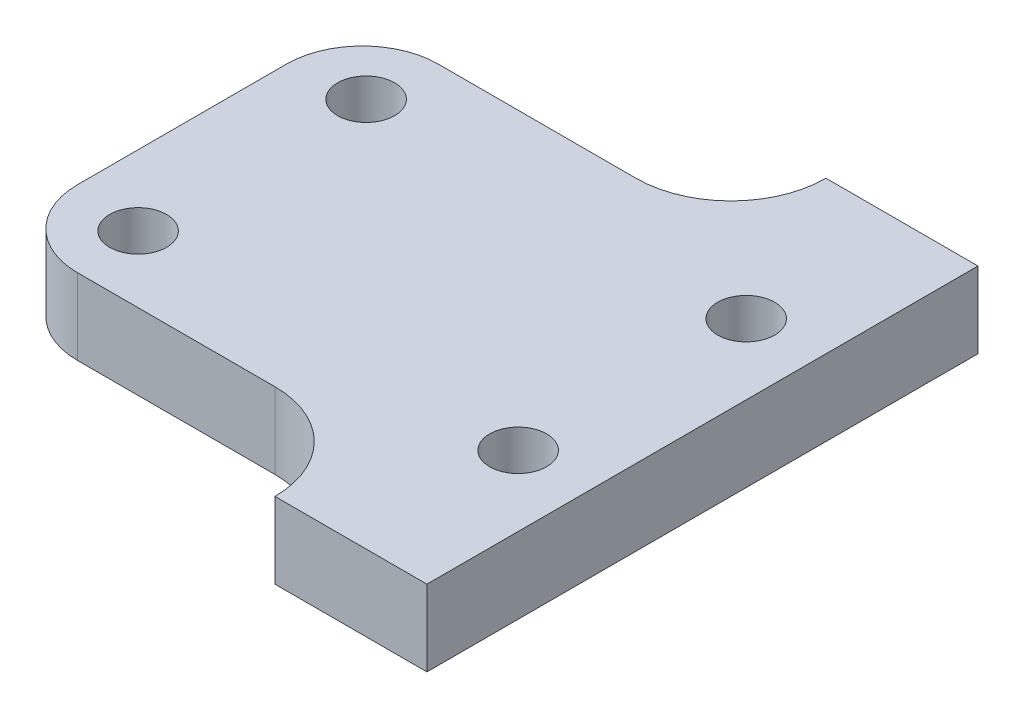
ISO-10303-21;
HEADER;
FILE_DESCRIPTION(('STEP AP214'),'2;1');
FILE_NAME('part.step','',(''),(''),'','','');
FILE_SCHEMA(('AUTOMOTIVE_DESIGN { 1 0 10303 214 1 1 1 1 }'));
ENDSEC;
DATA;
#1=APPLICATION_CONTEXT('core data for automotive mechanical design processes');
#2=APPLICATION_PROTOCOL_DEFINITION('international standard','automotive_design',2000,#1);
#3=PRODUCT_CONTEXT('',#1,'mechanical');
#4=PRODUCT('Part','Part','',(#3));
#5=PRODUCT_RELATED_PRODUCT_CATEGORY('part','',(#4));
#6=PRODUCT_DEFINITION_FORMATION('','',#4);
#7=PRODUCT_DEFINITION_CONTEXT('part definition',#1,'design');
#8=PRODUCT_DEFINITION('design','',#6,#7);
#9=PRODUCT_DEFINITION_SHAPE('','',#8);
#10=(LENGTH_UNIT() NAMED_UNIT(*) SI_UNIT(.MILLI.,.METRE.));
#11=(NAMED_UNIT(*) PLANE_ANGLE_UNIT() SI_UNIT($,.RADIAN.));
#12=(NAMED_UNIT(*) SI_UNIT($,.STERADIAN.) SOLID_ANGLE_UNIT());
#13=UNCERTAINTY_MEASURE_WITH_UNIT(LENGTH_MEASURE(1.E-05),#10,'distance_accuracy_value','');
#14=(GEOMETRIC_REPRESENTATION_CONTEXT(3) GLOBAL_UNCERTAINTY_ASSIGNED_CONTEXT((#13)) GLOBAL_UNIT_ASSIGNED_CONTEXT((#10,
#11,#12)) REPRESENTATION_CONTEXT('',''));
#15=CARTESIAN_POINT('',(0.,0.,0.));
#16=DIRECTION('',(0.,0.,1.));
#17=DIRECTION('',(1.,0.,0.));
#18=AXIS2_PLACEMENT_3D('',#15,#16,#17);
#19=CARTESIAN_POINT('',(-1.64036695723543,0.,3.));
#20=DIRECTION('',(1.,0.,0.));
#21=DIRECTION('',(0.,1.,0.));
#22=AXIS2_PLACEMENT_3D('',#19,#20,#21);
#23=PLANE('',#22);
#24=DIRECTION('',(0.,-1.,0.));
#25=VECTOR('',#24,1.);
#26=CARTESIAN_POINT('',(-1.6403669572354,-2.8815779893049,7.));
#27=LINE('',#26,#25);
#28=CARTESIAN_POINT('',(-1.6403669572354,-6.88157798930491,7.));
#29=VERTEX_POINT('',#28);
#30=CARTESIAN_POINT('',(-1.6403669572354,-2.8815779893049,7.));
#31=VERTEX_POINT('',#30);
#32=EDGE_CURVE('E191',#29,#31,#27,.F.);
#33=ORIENTED_EDGE('',*,*,#32,.T.);
#34=DIRECTION('',(0.,0.,1.));
#35=VECTOR('',#34,1.);
#36=CARTESIAN_POINT('',(-1.6403669572354,-2.8815779893049,-8.));
#37=LINE('',#36,#35);
#38=CARTESIAN_POINT('',(-1.6403669572354,-2.8815779893049,-4.));
#39=VERTEX_POINT('',#38);
#40=EDGE_CURVE('E180',#39,#31,#37,.T.);
#41=ORIENTED_EDGE('',*,*,#40,.F.);
#42=DIRECTION('',(0.,-1.,0.));
#43=VECTOR('',#42,1.);
#44=CARTESIAN_POINT('',(-1.64036695723543,0.,-4.));
#45=LINE('',#44,#43);
#46=CARTESIAN_POINT('',(-1.6403669572354,-6.88157798930491,-4.));
#47=VERTEX_POINT('',#46);
#48=EDGE_CURVE('E194',#39,#47,#45,.T.);
#49=ORIENTED_EDGE('',*,*,#48,.T.);
#50=DIRECTION('',(0.,0.,-1.));
#51=VECTOR('',#50,1.);
#52=CARTESIAN_POINT('',(-1.6403669572354,-6.88157798930491,3.));
#53=LINE('',#52,#51);
#54=EDGE_CURVE('E123',#29,#47,#53,.T.);
#55=ORIENTED_EDGE('',*,*,#54,.F.);
#56=EDGE_LOOP('',(#33,#41,#49,#55));
#57=FACE_BOUND('',#56,.T.);
#58=ADVANCED_FACE('F36',(#57),#23,.F.);
#59=CARTESIAN_POINT('',(25.7596330403458,-4.46858401878444E-13,3.));
#60=DIRECTION('',(-1.,0.,0.));
#61=DIRECTION('',(0.,-1.,0.));
#62=AXIS2_PLACEMENT_3D('',#59,#60,#61);
#63=PLANE('',#62);
#64=DIRECTION('',(0.,-1.,0.));
#65=VECTOR('',#64,1.);
#66=CARTESIAN_POINT('',(25.7596330403457,-2.8815779893049,-13.));
#67=LINE('',#66,#65);
#68=CARTESIAN_POINT('',(25.7596330403457,-2.8815779893049,-13.));
#69=VERTEX_POINT('',#68);
#70=CARTESIAN_POINT('',(25.7596330403457,-6.88157798930491,-13.));
#71=VERTEX_POINT('',#70);
#72=EDGE_CURVE('E117',#69,#71,#67,.T.);
#73=ORIENTED_EDGE('',*,*,#72,.F.);
#74=DIRECTION('',(0.,0.,-1.));
#75=VECTOR('',#74,1.);
#76=CARTESIAN_POINT('',(25.7596330403457,-2.8815779893049,11.));
#77=LINE('',#76,#75);
#78=CARTESIAN_POINT('',(25.7596330403457,-2.88157798930491,16.));
#79=VERTEX_POINT('',#78);
#80=EDGE_CURVE('E124',#79,#69,#77,.T.);
#81=ORIENTED_EDGE('',*,*,#80,.F.);
#82=DIRECTION('',(0.,1.,0.));
#83=VECTOR('',#82,1.);
#84=CARTESIAN_POINT('',(25.7596330403457,-6.88157798930491,16.));
#85=LINE('',#84,#83);
#86=CARTESIAN_POINT('',(25.7596330403457,-6.88157798930491,16.));
#87=VERTEX_POINT('',#86);
#88=EDGE_CURVE('E119',#87,#79,#85,.T.);
#89=ORIENTED_EDGE('',*,*,#88,.F.);
#90=DIRECTION('',(0.,0.,-1.));
#91=VECTOR('',#90,1.);
#92=CARTESIAN_POINT('',(25.7596330403457,-6.88157798930491,3.));
#93=LINE('',#92,#91);
#94=EDGE_CURVE('E113',#87,#71,#93,.T.);
#95=ORIENTED_EDGE('',*,*,#94,.T.);
#96=EDGE_LOOP('',(#73,#81,#89,#95));
#97=FACE_BOUND('',#96,.T.);
#98=ADVANCED_FACE('F115',(#97),#63,.F.);
#99=CARTESIAN_POINT('',(0.,0.,-8.));
#100=DIRECTION('',(0.,0.,1.));
#101=DIRECTION('',(1.,0.,0.));
#102=AXIS2_PLACEMENT_3D('',#99,#100,#101);
#103=PLANE('',#102);
#104=DIRECTION('',(1.,0.,0.));
#105=VECTOR('',#104,1.);
#106=CARTESIAN_POINT('',(0.,-2.8815779893049,-8.));
#107=LINE('',#106,#105);
#108=CARTESIAN_POINT('',(2.3596330427646,-2.8815779893049,-8.));
#109=VERTEX_POINT('',#108);
#110=CARTESIAN_POINT('',(12.7596330403457,-2.8815779893049,-8.));
#111=VERTEX_POINT('',#110);
#112=EDGE_CURVE('E178',#109,#111,#107,.T.);
#113=ORIENTED_EDGE('',*,*,#112,.T.);
#114=DIRECTION('',(0.,1.,0.));
#115=VECTOR('',#114,1.);
#116=CARTESIAN_POINT('',(12.7596330403457,-6.88157798930491,-8.));
#117=LINE('',#116,#115);
#118=CARTESIAN_POINT('',(12.7596330403457,-6.88157798930491,-8.));
#119=VERTEX_POINT('',#118);
#120=EDGE_CURVE('E57',#111,#119,#117,.F.);
#121=ORIENTED_EDGE('',*,*,#120,.T.);
#122=DIRECTION('',(1.,0.,0.));
#123=VECTOR('',#122,1.);
#124=CARTESIAN_POINT('',(0.,-6.88157798930491,-8.));
#125=LINE('',#124,#123);
#126=CARTESIAN_POINT('',(2.35963304276464,-6.88157798930491,-8.));
#127=VERTEX_POINT('',#126);
#128=EDGE_CURVE('E176',#127,#119,#125,.T.);
#129=ORIENTED_EDGE('',*,*,#128,.F.);
#130=DIRECTION('',(0.,-1.,0.));
#131=VECTOR('',#130,1.);
#132=CARTESIAN_POINT('',(2.35963304276457,0.,-8.));
#133=LINE('',#132,#131);
#134=EDGE_CURVE('E201',#127,#109,#133,.F.);
#135=ORIENTED_EDGE('',*,*,#134,.T.);
#136=EDGE_LOOP('',(#113,#121,#129,#135));
#137=FACE_BOUND('',#136,.T.);
#138=ADVANCED_FACE('F243',(#137),#103,.F.);
#139=CARTESIAN_POINT('',(0.,0.,11.));
#140=DIRECTION('',(0.,0.,1.));
#141=DIRECTION('',(1.,0.,0.));
#142=AXIS2_PLACEMENT_3D('',#139,#140,#141);
#143=PLANE('',#142);
#144=DIRECTION('',(1.,0.,0.));
#145=VECTOR('',#144,1.);
#146=CARTESIAN_POINT('',(0.,-6.88157798930491,11.));
#147=LINE('',#146,#145);
#148=CARTESIAN_POINT('',(2.35963304276464,-6.88157798930491,11.));
#149=VERTEX_POINT('',#148);
#150=CARTESIAN_POINT('',(12.7596330403457,-6.88157798930491,11.));
#151=VERTEX_POINT('',#150);
#152=EDGE_CURVE('E182',#149,#151,#147,.T.);
#153=ORIENTED_EDGE('',*,*,#152,.T.);
#154=DIRECTION('',(0.,-1.,0.));
#155=VECTOR('',#154,1.);
#156=CARTESIAN_POINT('',(12.7596330403457,0.,11.));
#157=LINE('',#156,#155);
#158=CARTESIAN_POINT('',(12.7596330403457,-2.8815779893049,11.));
#159=VERTEX_POINT('',#158);
#160=EDGE_CURVE('E210',#151,#159,#157,.F.);
#161=ORIENTED_EDGE('',*,*,#160,.T.);
#162=DIRECTION('',(1.,0.,0.));
#163=VECTOR('',#162,1.);
#164=CARTESIAN_POINT('',(0.,-2.8815779893049,11.));
#165=LINE('',#164,#163);
#166=CARTESIAN_POINT('',(2.3596330427646,-2.8815779893049,11.));
#167=VERTEX_POINT('',#166);
#168=EDGE_CURVE('E185',#167,#159,#165,.T.);
#169=ORIENTED_EDGE('',*,*,#168,.F.);
#170=DIRECTION('',(0.,-1.,0.));
#171=VECTOR('',#170,1.);
#172=CARTESIAN_POINT('',(2.35963304276464,-6.88157798930487,11.));
#173=LINE('',#172,#171);
#174=EDGE_CURVE('E205',#167,#149,#173,.T.);
#175=ORIENTED_EDGE('',*,*,#174,.T.);
#176=EDGE_LOOP('',(#153,#161,#169,#175));
#177=FACE_BOUND('',#176,.T.);
#178=ADVANCED_FACE('F229',(#177),#143,.T.);
#179=CARTESIAN_POINT('',(0.,-6.88157798930491,3.));
#180=DIRECTION('',(0.,1.,0.));
#181=DIRECTION('',(0.,0.,1.));
#182=AXIS2_PLACEMENT_3D('',#179,#180,#181);
#183=PLANE('',#182);
#184=CARTESIAN_POINT('',(22.0596330415552,-6.88157798930491,7.5));
#185=DIRECTION('',(0.,1.,0.));
#186=DIRECTION('',(0.,0.,1.));
#187=AXIS2_PLACEMENT_3D('',#184,#185,#186);
#188=CIRCLE('',#187,1.5);
#189=CARTESIAN_POINT('',(22.0596330415552,-6.88157798930491,9.));
#190=VERTEX_POINT('',#189);
#191=EDGE_CURVE('E170',#190,#190,#188,.T.);
#192=ORIENTED_EDGE('',*,*,#191,.T.);
#193=EDGE_LOOP('',(#192));
#194=FACE_BOUND('',#193,.T.);
#195=CARTESIAN_POINT('',(22.0596330415552,-6.88157798930491,-4.5));
#196=DIRECTION('',(0.,1.,0.));
#197=DIRECTION('',(0.,0.,1.));
#198=AXIS2_PLACEMENT_3D('',#195,#196,#197);
#199=CIRCLE('',#198,1.5);
#200=CARTESIAN_POINT('',(22.0596330415552,-6.88157798930491,-3.));
#201=VERTEX_POINT('',#200);
#202=EDGE_CURVE('E167',#201,#201,#199,.T.);
#203=ORIENTED_EDGE('',*,*,#202,.T.);
#204=EDGE_LOOP('',(#203));
#205=FACE_BOUND('',#204,.T.);
#206=ORIENTED_EDGE('',*,*,#94,.F.);
#207=DIRECTION('',(1.,0.,0.));
#208=VECTOR('',#207,1.);
#209=CARTESIAN_POINT('',(25.7596330403457,-6.88157798930491,16.));
#210=LINE('',#209,#208);
#211=CARTESIAN_POINT('',(17.7596330403457,-6.88157798930491,16.));
#212=VERTEX_POINT('',#211);
#213=EDGE_CURVE('E150',#212,#87,#210,.T.);
#214=ORIENTED_EDGE('',*,*,#213,.F.);
#215=CARTESIAN_POINT('',(12.7596330403457,-6.88157798930491,16.));
#216=DIRECTION('',(0.,1.,0.));
#217=DIRECTION('',(0.,0.,1.));
#218=AXIS2_PLACEMENT_3D('',#215,#216,#217);
#219=CIRCLE('',#218,5.);
#220=EDGE_CURVE('E213',#212,#151,#219,.T.);
#221=ORIENTED_EDGE('',*,*,#220,.T.);
#222=ORIENTED_EDGE('',*,*,#152,.F.);
#223=CARTESIAN_POINT('',(2.35963304276464,-6.88157798930491,7.));
#224=DIRECTION('',(0.,1.,0.));
#225=DIRECTION('',(0.,0.,1.));
#226=AXIS2_PLACEMENT_3D('',#223,#224,#225);
#227=CIRCLE('',#226,4.);
#228=EDGE_CURVE('E197',#149,#29,#227,.F.);
#229=ORIENTED_EDGE('',*,*,#228,.T.);
#230=ORIENTED_EDGE('',*,*,#54,.T.);
#231=CARTESIAN_POINT('',(2.35963304276464,-6.88157798930491,-4.));
#232=DIRECTION('',(0.,1.,0.));
#233=DIRECTION('',(0.,0.,1.));
#234=AXIS2_PLACEMENT_3D('',#231,#232,#233);
#235=CIRCLE('',#234,4.);
#236=EDGE_CURVE('E199',#47,#127,#235,.F.);
#237=ORIENTED_EDGE('',*,*,#236,.T.);
#238=ORIENTED_EDGE('',*,*,#128,.T.);
#239=CARTESIAN_POINT('',(12.7596330403457,-6.88157798930491,-13.));
#240=DIRECTION('',(0.,1.,0.));
#241=DIRECTION('',(0.,0.,1.));
#242=AXIS2_PLACEMENT_3D('',#239,#240,#241);
#243=CIRCLE('',#242,5.);
#244=CARTESIAN_POINT('',(17.7596330403457,-6.88157798930491,-13.));
#245=VERTEX_POINT('',#244);
#246=EDGE_CURVE('E11',#119,#245,#243,.T.);
#247=ORIENTED_EDGE('',*,*,#246,.T.);
#248=DIRECTION('',(-1.,0.,0.));
#249=VECTOR('',#248,1.);
#250=CARTESIAN_POINT('',(25.7596330403457,-6.88157798930491,-13.));
#251=LINE('',#250,#249);
#252=EDGE_CURVE('E127',#71,#245,#251,.T.);
#253=ORIENTED_EDGE('',*,*,#252,.F.);
#254=EDGE_LOOP('',(#206,#214,#221,#222,#229,#230,#237,#238,#247,#253));
#255=FACE_BOUND('',#254,.T.);
#256=CARTESIAN_POINT('',(2.05963304155515,-6.88157798930491,7.5));
#257=DIRECTION('',(0.,1.,0.));
#258=DIRECTION('',(0.,0.,1.));
#259=AXIS2_PLACEMENT_3D('',#256,#257,#258);
#260=CIRCLE('',#259,1.5);
#261=CARTESIAN_POINT('',(2.05963304155515,-6.88157798930491,9.));
#262=VERTEX_POINT('',#261);
#263=EDGE_CURVE('E173',#262,#262,#260,.T.);
#264=ORIENTED_EDGE('',*,*,#263,.T.);
#265=EDGE_LOOP('',(#264));
#266=FACE_BOUND('',#265,.T.);
#267=CARTESIAN_POINT('',(2.05963304155515,-6.88157798930491,-4.5));
#268=DIRECTION('',(0.,1.,0.));
#269=DIRECTION('',(0.,0.,1.));
#270=AXIS2_PLACEMENT_3D('',#267,#268,#269);
#271=CIRCLE('',#270,1.5);
#272=CARTESIAN_POINT('',(2.05963304155515,-6.88157798930491,-3.));
#273=VERTEX_POINT('',#272);
#274=EDGE_CURVE('E164',#273,#273,#271,.T.);
#275=ORIENTED_EDGE('',*,*,#274,.T.);
#276=EDGE_LOOP('',(#275));
#277=FACE_BOUND('',#276,.T.);
#278=ADVANCED_FACE('F128',(#194,#205,#255,#266,#277),#183,.F.);
#279=CARTESIAN_POINT('',(0.,-2.8815779893049,11.));
#280=DIRECTION('',(0.,1.,0.));
#281=DIRECTION('',(0.,0.,1.));
#282=AXIS2_PLACEMENT_3D('',#279,#280,#281);
#283=PLANE('',#282);
#284=CARTESIAN_POINT('',(2.05963304155515,-2.8815779893049,7.5));
#285=DIRECTION('',(0.,1.,0.));
#286=DIRECTION('',(0.,0.,1.));
#287=AXIS2_PLACEMENT_3D('',#284,#285,#286);
#288=CIRCLE('',#287,1.5);
#289=CARTESIAN_POINT('',(2.05963304155515,-2.8815779893049,9.));
#290=VERTEX_POINT('',#289);
#291=EDGE_CURVE('E152',#290,#290,#288,.T.);
#292=ORIENTED_EDGE('',*,*,#291,.F.);
#293=EDGE_LOOP('',(#292));
#294=FACE_BOUND('',#293,.T.);
#295=CARTESIAN_POINT('',(22.0596330415552,-2.8815779893049,7.5));
#296=DIRECTION('',(0.,1.,0.));
#297=DIRECTION('',(0.,0.,1.));
#298=AXIS2_PLACEMENT_3D('',#295,#296,#297);
#299=CIRCLE('',#298,1.5);
#300=CARTESIAN_POINT('',(22.0596330415552,-2.8815779893049,9.));
#301=VERTEX_POINT('',#300);
#302=EDGE_CURVE('E157',#301,#301,#299,.T.);
#303=ORIENTED_EDGE('',*,*,#302,.F.);
#304=EDGE_LOOP('',(#303));
#305=FACE_BOUND('',#304,.T.);
#306=ORIENTED_EDGE('',*,*,#40,.T.);
#307=CARTESIAN_POINT('',(2.3596330427646,-2.8815779893049,7.));
#308=DIRECTION('',(0.,1.,0.));
#309=DIRECTION('',(0.,0.,1.));
#310=AXIS2_PLACEMENT_3D('',#307,#308,#309);
#311=CIRCLE('',#310,4.);
#312=EDGE_CURVE('E208',#31,#167,#311,.T.);
#313=ORIENTED_EDGE('',*,*,#312,.T.);
#314=ORIENTED_EDGE('',*,*,#168,.T.);
#315=CARTESIAN_POINT('',(12.7596330403457,-2.88157798930491,16.));
#316=DIRECTION('',(0.,1.,0.));
#317=DIRECTION('',(0.,0.,1.));
#318=AXIS2_PLACEMENT_3D('',#315,#316,#317);
#319=CIRCLE('',#318,5.);
#320=CARTESIAN_POINT('',(17.7596330403457,-2.88157798930491,16.));
#321=VERTEX_POINT('',#320);
#322=EDGE_CURVE('E215',#159,#321,#319,.F.);
#323=ORIENTED_EDGE('',*,*,#322,.T.);
#324=DIRECTION('',(-1.,0.,0.));
#325=VECTOR('',#324,1.);
#326=CARTESIAN_POINT('',(25.7596330403457,-2.88157798930491,16.));
#327=LINE('',#326,#325);
#328=EDGE_CURVE('E144',#79,#321,#327,.T.);
#329=ORIENTED_EDGE('',*,*,#328,.F.);
#330=ORIENTED_EDGE('',*,*,#80,.T.);
#331=DIRECTION('',(1.,0.,0.));
#332=VECTOR('',#331,1.);
#333=CARTESIAN_POINT('',(25.7596330403457,-2.8815779893049,-13.));
#334=LINE('',#333,#332);
#335=CARTESIAN_POINT('',(17.7596330403457,-2.8815779893049,-13.));
#336=VERTEX_POINT('',#335);
#337=EDGE_CURVE('E138',#336,#69,#334,.T.);
#338=ORIENTED_EDGE('',*,*,#337,.F.);
#339=CARTESIAN_POINT('',(12.7596330403457,-2.8815779893049,-13.));
#340=DIRECTION('',(0.,1.,0.));
#341=DIRECTION('',(0.,0.,1.));
#342=AXIS2_PLACEMENT_3D('',#339,#340,#341);
#343=CIRCLE('',#342,5.);
#344=EDGE_CURVE('E44',#336,#111,#343,.F.);
#345=ORIENTED_EDGE('',*,*,#344,.T.);
#346=ORIENTED_EDGE('',*,*,#112,.F.);
#347=CARTESIAN_POINT('',(2.3596330427646,-2.8815779893049,-4.));
#348=DIRECTION('',(0.,-1.,0.));
#349=DIRECTION('',(0.,0.,-1.));
#350=AXIS2_PLACEMENT_3D('',#347,#348,#349);
#351=CIRCLE('',#350,4.);
#352=EDGE_CURVE('E203',#109,#39,#351,.F.);
#353=ORIENTED_EDGE('',*,*,#352,.T.);
#354=EDGE_LOOP('',(#306,#313,#314,#323,#329,#330,#338,#345,#346,#353));
#355=FACE_BOUND('',#354,.T.);
#356=CARTESIAN_POINT('',(22.0596330415552,-2.8815779893049,-4.5));
#357=DIRECTION('',(0.,1.,0.));
#358=DIRECTION('',(0.,0.,1.));
#359=AXIS2_PLACEMENT_3D('',#356,#357,#358);
#360=CIRCLE('',#359,1.5);
#361=CARTESIAN_POINT('',(22.0596330415552,-2.8815779893049,-3.));
#362=VERTEX_POINT('',#361);
#363=EDGE_CURVE('E153',#362,#362,#360,.T.);
#364=ORIENTED_EDGE('',*,*,#363,.F.);
#365=EDGE_LOOP('',(#364));
#366=FACE_BOUND('',#365,.T.);
#367=CARTESIAN_POINT('',(2.05963304155515,-2.8815779893049,-4.5));
#368=DIRECTION('',(0.,1.,0.));
#369=DIRECTION('',(0.,0.,1.));
#370=AXIS2_PLACEMENT_3D('',#367,#368,#369);
#371=CIRCLE('',#370,1.5);
#372=CARTESIAN_POINT('',(2.05963304155515,-2.8815779893049,-3.));
#373=VERTEX_POINT('',#372);
#374=EDGE_CURVE('E156',#373,#373,#371,.T.);
#375=ORIENTED_EDGE('',*,*,#374,.F.);
#376=EDGE_LOOP('',(#375));
#377=FACE_BOUND('',#376,.T.);
#378=ADVANCED_FACE('F218',(#294,#305,#355,#366,#377),#283,.T.);
#379=CARTESIAN_POINT('',(2.05963304155515,-9.3815779893049,-4.5));
#380=DIRECTION('',(0.,1.,0.));
#381=DIRECTION('',(0.,0.,1.));
#382=AXIS2_PLACEMENT_3D('',#379,#380,#381);
#383=CYLINDRICAL_SURFACE('',#382,1.5);
#384=CARTESIAN_POINT('',(2.05963304155515,-2.8815779893049,-3.));
#385=CARTESIAN_POINT('',(2.05963304155515,-2.92324465597157,-3.));
#386=CARTESIAN_POINT('',(2.05963304155515,-2.96491132263824,-3.));
#387=CARTESIAN_POINT('',(2.05963304155515,-3.04824465597157,-3.));
#388=CARTESIAN_POINT('',(2.05963304155515,-3.08991132263824,-3.));
#389=CARTESIAN_POINT('',(2.05963304155515,-3.17324465597157,-3.));
#390=CARTESIAN_POINT('',(2.05963304155515,-3.21491132263824,-3.));
#391=CARTESIAN_POINT('',(2.05963304155515,-3.29824465597157,-3.));
#392=CARTESIAN_POINT('',(2.05963304155515,-3.33991132263824,-3.));
#393=CARTESIAN_POINT('',(2.05963304155515,-3.42324465597157,-3.));
#394=CARTESIAN_POINT('',(2.05963304155515,-3.46491132263824,-3.));
#395=CARTESIAN_POINT('',(2.05963304155515,-3.54824465597157,-3.));
#396=CARTESIAN_POINT('',(2.05963304155515,-3.58991132263824,-3.));
#397=CARTESIAN_POINT('',(2.05963304155515,-3.67324465597157,-3.));
#398=CARTESIAN_POINT('',(2.05963304155515,-3.71491132263824,-3.));
#399=CARTESIAN_POINT('',(2.05963304155515,-3.79824465597157,-3.));
#400=CARTESIAN_POINT('',(2.05963304155515,-3.83991132263824,-3.));
#401=CARTESIAN_POINT('',(2.05963304155515,-3.92324465597157,-3.));
#402=CARTESIAN_POINT('',(2.05963304155515,-3.96491132263824,-3.));
#403=CARTESIAN_POINT('',(2.05963304155515,-4.04824465597157,-3.));
#404=CARTESIAN_POINT('',(2.05963304155515,-4.08991132263824,-3.));
#405=CARTESIAN_POINT('',(2.05963304155515,-4.17324465597157,-3.));
#406=CARTESIAN_POINT('',(2.05963304155515,-4.21491132263824,-3.));
#407=CARTESIAN_POINT('',(2.05963304155515,-4.29824465597157,-3.));
#408=CARTESIAN_POINT('',(2.05963304155515,-4.33991132263824,-3.));
#409=CARTESIAN_POINT('',(2.05963304155515,-4.42324465597157,-3.));
#410=CARTESIAN_POINT('',(2.05963304155515,-4.46491132263824,-3.));
#411=CARTESIAN_POINT('',(2.05963304155515,-4.54824465597157,-3.));
#412=CARTESIAN_POINT('',(2.05963304155515,-4.58991132263824,-3.));
#413=CARTESIAN_POINT('',(2.05963304155515,-4.67324465597157,-3.));
#414=CARTESIAN_POINT('',(2.05963304155515,-4.71491132263824,-3.));
#415=CARTESIAN_POINT('',(2.05963304155515,-4.79824465597157,-3.));
#416=CARTESIAN_POINT('',(2.05963304155515,-4.83991132263824,-3.));
#417=CARTESIAN_POINT('',(2.05963304155515,-4.92324465597157,-3.));
#418=CARTESIAN_POINT('',(2.05963304155515,-4.96491132263824,-3.));
#419=CARTESIAN_POINT('',(2.05963304155515,-5.04824465597157,-3.));
#420=CARTESIAN_POINT('',(2.05963304155515,-5.08991132263824,-3.));
#421=CARTESIAN_POINT('',(2.05963304155515,-5.17324465597157,-3.));
#422=CARTESIAN_POINT('',(2.05963304155515,-5.21491132263824,-3.));
#423=CARTESIAN_POINT('',(2.05963304155515,-5.29824465597157,-3.));
#424=CARTESIAN_POINT('',(2.05963304155515,-5.33991132263824,-3.));
#425=CARTESIAN_POINT('',(2.05963304155515,-5.42324465597157,-3.));
#426=CARTESIAN_POINT('',(2.05963304155515,-5.46491132263824,-3.));
#427=CARTESIAN_POINT('',(2.05963304155515,-5.54824465597157,-3.));
#428=CARTESIAN_POINT('',(2.05963304155515,-5.58991132263824,-3.));
#429=CARTESIAN_POINT('',(2.05963304155515,-5.67324465597157,-3.));
#430=CARTESIAN_POINT('',(2.05963304155515,-5.71491132263824,-3.));
#431=CARTESIAN_POINT('',(2.05963304155515,-5.79824465597157,-3.));
#432=CARTESIAN_POINT('',(2.05963304155515,-5.83991132263824,-3.));
#433=CARTESIAN_POINT('',(2.05963304155515,-5.92324465597157,-3.));
#434=CARTESIAN_POINT('',(2.05963304155515,-5.96491132263824,-3.));
#435=CARTESIAN_POINT('',(2.05963304155515,-6.04824465597157,-3.));
#436=CARTESIAN_POINT('',(2.05963304155515,-6.08991132263824,-3.));
#437=CARTESIAN_POINT('',(2.05963304155515,-6.17324465597157,-3.));
#438=CARTESIAN_POINT('',(2.05963304155515,-6.21491132263824,-3.));
#439=CARTESIAN_POINT('',(2.05963304155515,-6.29824465597157,-3.));
#440=CARTESIAN_POINT('',(2.05963304155515,-6.33991132263824,-3.));
#441=CARTESIAN_POINT('',(2.05963304155515,-6.42324465597157,-3.));
#442=CARTESIAN_POINT('',(2.05963304155515,-6.46491132263824,-3.));
#443=CARTESIAN_POINT('',(2.05963304155515,-6.54824465597157,-3.));
#444=CARTESIAN_POINT('',(2.05963304155515,-6.58991132263824,-3.));
#445=CARTESIAN_POINT('',(2.05963304155515,-6.67324465597157,-3.));
#446=CARTESIAN_POINT('',(2.05963304155515,-6.71491132263824,-3.));
#447=CARTESIAN_POINT('',(2.05963304155515,-6.79824465597157,-3.));
#448=CARTESIAN_POINT('',(2.05963304155515,-6.83991132263824,-3.));
#449=CARTESIAN_POINT('',(2.05963304155515,-6.88157798930491,-3.));
#450=B_SPLINE_CURVE_WITH_KNOTS('',3,(#384,#385,#386,#387,#388,#389,#390,#391,#392,#393,#394,
#395,#396,#397,#398,#399,#400,#401,#402,#403,#404,#405,#406,#407,#408,#409,#410,#411,#412,#413,
#414,#415,#416,#417,#418,#419,#420,#421,#422,#423,#424,#425,#426,#427,#428,#429,#430,#431,#432,
#433,#434,#435,#436,#437,#438,#439,#440,#441,#442,#443,#444,#445,#446,#447,#448,#449),
.UNSPECIFIED.,.F.,.F.,(4,2,2,2,2,2,2,2,2,2,2,2,2,2,2,2,2,2,2,2,2,2,2,2,2,2,2,2,2,2,2,2,4),(0.,
0.125,0.25,0.375,0.5,0.625000000000001,0.750000000000001,0.875000000000001,1.,1.125,1.25,1.375,
1.5,1.625,1.75,1.875,2.,2.125,2.25,2.375,2.5,2.625,2.75,2.875,3.,3.125,3.25,3.375,3.5,3.625,
3.75,3.875,4.),.UNSPECIFIED.);
#451=EDGE_CURVE('BSEAM274',#373,#273,#450,.T.);
#452=ORIENTED_EDGE('',*,*,#374,.T.);
#453=ORIENTED_EDGE('',*,*,#274,.F.);
#454=ORIENTED_EDGE('',*,*,#451,.T.);
#455=ORIENTED_EDGE('',*,*,#451,.F.);
#456=EDGE_LOOP('',(#452,#454,#453,#455));
#457=FACE_BOUND('',#456,.T.);
#458=ADVANCED_FACE('F274',(#457),#383,.F.);
#459=CARTESIAN_POINT('',(22.0596330415552,-9.3815779893049,-4.5));
#460=DIRECTION('',(0.,1.,0.));
#461=DIRECTION('',(0.,0.,1.));
#462=AXIS2_PLACEMENT_3D('',#459,#460,#461);
#463=CYLINDRICAL_SURFACE('',#462,1.5);
#464=CARTESIAN_POINT('',(22.0596330415552,-2.8815779893049,-3.));
#465=CARTESIAN_POINT('',(22.0596330415552,-2.92324465597157,-3.));
#466=CARTESIAN_POINT('',(22.0596330415552,-2.96491132263824,-3.));
#467=CARTESIAN_POINT('',(22.0596330415552,-3.04824465597157,-3.));
#468=CARTESIAN_POINT('',(22.0596330415552,-3.08991132263824,-3.));
#469=CARTESIAN_POINT('',(22.0596330415552,-3.17324465597157,-3.));
#470=CARTESIAN_POINT('',(22.0596330415552,-3.21491132263824,-3.));
#471=CARTESIAN_POINT('',(22.0596330415552,-3.29824465597157,-3.));
#472=CARTESIAN_POINT('',(22.0596330415552,-3.33991132263824,-3.));
#473=CARTESIAN_POINT('',(22.0596330415552,-3.42324465597157,-3.));
#474=CARTESIAN_POINT('',(22.0596330415552,-3.46491132263824,-3.));
#475=CARTESIAN_POINT('',(22.0596330415552,-3.54824465597157,-3.));
#476=CARTESIAN_POINT('',(22.0596330415552,-3.58991132263824,-3.));
#477=CARTESIAN_POINT('',(22.0596330415552,-3.67324465597157,-3.));
#478=CARTESIAN_POINT('',(22.0596330415552,-3.71491132263824,-3.));
#479=CARTESIAN_POINT('',(22.0596330415552,-3.79824465597157,-3.));
#480=CARTESIAN_POINT('',(22.0596330415552,-3.83991132263824,-3.));
#481=CARTESIAN_POINT('',(22.0596330415552,-3.92324465597157,-3.));
#482=CARTESIAN_POINT('',(22.0596330415552,-3.96491132263824,-3.));
#483=CARTESIAN_POINT('',(22.0596330415552,-4.04824465597157,-3.));
#484=CARTESIAN_POINT('',(22.0596330415552,-4.08991132263824,-3.));
#485=CARTESIAN_POINT('',(22.0596330415552,-4.17324465597157,-3.));
#486=CARTESIAN_POINT('',(22.0596330415552,-4.21491132263824,-3.));
#487=CARTESIAN_POINT('',(22.0596330415552,-4.29824465597157,-3.));
#488=CARTESIAN_POINT('',(22.0596330415552,-4.33991132263824,-3.));
#489=CARTESIAN_POINT('',(22.0596330415552,-4.42324465597157,-3.));
#490=CARTESIAN_POINT('',(22.0596330415552,-4.46491132263824,-3.));
#491=CARTESIAN_POINT('',(22.0596330415552,-4.54824465597157,-3.));
#492=CARTESIAN_POINT('',(22.0596330415552,-4.58991132263824,-3.));
#493=CARTESIAN_POINT('',(22.0596330415552,-4.67324465597157,-3.));
#494=CARTESIAN_POINT('',(22.0596330415552,-4.71491132263824,-3.));
#495=CARTESIAN_POINT('',(22.0596330415552,-4.79824465597157,-3.));
#496=CARTESIAN_POINT('',(22.0596330415552,-4.83991132263824,-3.));
#497=CARTESIAN_POINT('',(22.0596330415552,-4.92324465597157,-3.));
#498=CARTESIAN_POINT('',(22.0596330415552,-4.96491132263824,-3.));
#499=CARTESIAN_POINT('',(22.0596330415552,-5.04824465597157,-3.));
#500=CARTESIAN_POINT('',(22.0596330415552,-5.08991132263824,-3.));
#501=CARTESIAN_POINT('',(22.0596330415552,-5.17324465597157,-3.));
#502=CARTESIAN_POINT('',(22.0596330415552,-5.21491132263824,-3.));
#503=CARTESIAN_POINT('',(22.0596330415552,-5.29824465597157,-3.));
#504=CARTESIAN_POINT('',(22.0596330415552,-5.33991132263824,-3.));
#505=CARTESIAN_POINT('',(22.0596330415552,-5.42324465597157,-3.));
#506=CARTESIAN_POINT('',(22.0596330415552,-5.46491132263824,-3.));
#507=CARTESIAN_POINT('',(22.0596330415552,-5.54824465597157,-3.));
#508=CARTESIAN_POINT('',(22.0596330415552,-5.58991132263824,-3.));
#509=CARTESIAN_POINT('',(22.0596330415552,-5.67324465597157,-3.));
#510=CARTESIAN_POINT('',(22.0596330415552,-5.71491132263824,-3.));
#511=CARTESIAN_POINT('',(22.0596330415552,-5.79824465597157,-3.));
#512=CARTESIAN_POINT('',(22.0596330415552,-5.83991132263824,-3.));
#513=CARTESIAN_POINT('',(22.0596330415552,-5.92324465597157,-3.));
#514=CARTESIAN_POINT('',(22.0596330415552,-5.96491132263824,-3.));
#515=CARTESIAN_POINT('',(22.0596330415552,-6.04824465597157,-3.));
#516=CARTESIAN_POINT('',(22.0596330415552,-6.08991132263824,-3.));
#517=CARTESIAN_POINT('',(22.0596330415552,-6.17324465597157,-3.));
#518=CARTESIAN_POINT('',(22.0596330415552,-6.21491132263824,-3.));
#519=CARTESIAN_POINT('',(22.0596330415552,-6.29824465597157,-3.));
#520=CARTESIAN_POINT('',(22.0596330415552,-6.33991132263824,-3.));
#521=CARTESIAN_POINT('',(22.0596330415552,-6.42324465597157,-3.));
#522=CARTESIAN_POINT('',(22.0596330415552,-6.46491132263824,-3.));
#523=CARTESIAN_POINT('',(22.0596330415552,-6.54824465597157,-3.));
#524=CARTESIAN_POINT('',(22.0596330415552,-6.58991132263824,-3.));
#525=CARTESIAN_POINT('',(22.0596330415552,-6.67324465597157,-3.));
#526=CARTESIAN_POINT('',(22.0596330415552,-6.71491132263824,-3.));
#527=CARTESIAN_POINT('',(22.0596330415552,-6.79824465597157,-3.));
#528=CARTESIAN_POINT('',(22.0596330415552,-6.83991132263824,-3.));
#529=CARTESIAN_POINT('',(22.0596330415552,-6.88157798930491,-3.));
#530=B_SPLINE_CURVE_WITH_KNOTS('',3,(#464,#465,#466,#467,#468,#469,#470,#471,#472,#473,#474,
#475,#476,#477,#478,#479,#480,#481,#482,#483,#484,#485,#486,#487,#488,#489,#490,#491,#492,#493,
#494,#495,#496,#497,#498,#499,#500,#501,#502,#503,#504,#505,#506,#507,#508,#509,#510,#511,#512,
#513,#514,#515,#516,#517,#518,#519,#520,#521,#522,#523,#524,#525,#526,#527,#528,#529),
.UNSPECIFIED.,.F.,.F.,(4,2,2,2,2,2,2,2,2,2,2,2,2,2,2,2,2,2,2,2,2,2,2,2,2,2,2,2,2,2,2,2,4),(0.,
0.125,0.25,0.375,0.5,0.625000000000001,0.750000000000001,0.875000000000001,1.,1.125,1.25,1.375,
1.5,1.625,1.75,1.875,2.,2.125,2.25,2.375,2.5,2.625,2.75,2.875,3.,3.125,3.25,3.375,3.5,3.625,
3.75,3.875,4.),.UNSPECIFIED.);
#531=EDGE_CURVE('BSEAM270',#362,#201,#530,.T.);
#532=ORIENTED_EDGE('',*,*,#363,.T.);
#533=ORIENTED_EDGE('',*,*,#202,.F.);
#534=ORIENTED_EDGE('',*,*,#531,.T.);
#535=ORIENTED_EDGE('',*,*,#531,.F.);
#536=EDGE_LOOP('',(#532,#534,#533,#535));
#537=FACE_BOUND('',#536,.T.);
#538=ADVANCED_FACE('F270',(#537),#463,.F.);
#539=CARTESIAN_POINT('',(22.0596330415552,-9.3815779893049,7.5));
#540=DIRECTION('',(0.,1.,0.));
#541=DIRECTION('',(0.,0.,1.));
#542=AXIS2_PLACEMENT_3D('',#539,#540,#541);
#543=CYLINDRICAL_SURFACE('',#542,1.5);
#544=CARTESIAN_POINT('',(22.0596330415552,-2.8815779893049,9.));
#545=CARTESIAN_POINT('',(22.0596330415552,-2.92324465597157,9.));
#546=CARTESIAN_POINT('',(22.0596330415552,-2.96491132263824,9.));
#547=CARTESIAN_POINT('',(22.0596330415552,-3.04824465597157,9.));
#548=CARTESIAN_POINT('',(22.0596330415552,-3.08991132263824,9.));
#549=CARTESIAN_POINT('',(22.0596330415552,-3.17324465597157,9.));
#550=CARTESIAN_POINT('',(22.0596330415552,-3.21491132263824,9.));
#551=CARTESIAN_POINT('',(22.0596330415552,-3.29824465597157,9.));
#552=CARTESIAN_POINT('',(22.0596330415552,-3.33991132263824,9.));
#553=CARTESIAN_POINT('',(22.0596330415552,-3.42324465597157,9.));
#554=CARTESIAN_POINT('',(22.0596330415552,-3.46491132263824,9.));
#555=CARTESIAN_POINT('',(22.0596330415552,-3.54824465597157,9.));
#556=CARTESIAN_POINT('',(22.0596330415552,-3.58991132263824,9.));
#557=CARTESIAN_POINT('',(22.0596330415552,-3.67324465597157,9.));
#558=CARTESIAN_POINT('',(22.0596330415552,-3.71491132263824,9.));
#559=CARTESIAN_POINT('',(22.0596330415552,-3.79824465597157,9.));
#560=CARTESIAN_POINT('',(22.0596330415552,-3.83991132263824,9.));
#561=CARTESIAN_POINT('',(22.0596330415552,-3.92324465597157,9.));
#562=CARTESIAN_POINT('',(22.0596330415552,-3.96491132263824,9.));
#563=CARTESIAN_POINT('',(22.0596330415552,-4.04824465597157,9.));
#564=CARTESIAN_POINT('',(22.0596330415552,-4.08991132263824,9.));
#565=CARTESIAN_POINT('',(22.0596330415552,-4.17324465597157,9.));
#566=CARTESIAN_POINT('',(22.0596330415552,-4.21491132263824,9.));
#567=CARTESIAN_POINT('',(22.0596330415552,-4.29824465597157,9.));
#568=CARTESIAN_POINT('',(22.0596330415552,-4.33991132263824,9.));
#569=CARTESIAN_POINT('',(22.0596330415552,-4.42324465597157,9.));
#570=CARTESIAN_POINT('',(22.0596330415552,-4.46491132263824,9.));
#571=CARTESIAN_POINT('',(22.0596330415552,-4.54824465597157,9.));
#572=CARTESIAN_POINT('',(22.0596330415552,-4.58991132263824,9.));
#573=CARTESIAN_POINT('',(22.0596330415552,-4.67324465597157,9.));
#574=CARTESIAN_POINT('',(22.0596330415552,-4.71491132263824,9.));
#575=CARTESIAN_POINT('',(22.0596330415552,-4.79824465597157,9.));
#576=CARTESIAN_POINT('',(22.0596330415552,-4.83991132263824,9.));
#577=CARTESIAN_POINT('',(22.0596330415552,-4.92324465597157,9.));
#578=CARTESIAN_POINT('',(22.0596330415552,-4.96491132263824,9.));
#579=CARTESIAN_POINT('',(22.0596330415552,-5.04824465597157,9.));
#580=CARTESIAN_POINT('',(22.0596330415552,-5.08991132263824,9.));
#581=CARTESIAN_POINT('',(22.0596330415552,-5.17324465597157,9.));
#582=CARTESIAN_POINT('',(22.0596330415552,-5.21491132263824,9.));
#583=CARTESIAN_POINT('',(22.0596330415552,-5.29824465597157,9.));
#584=CARTESIAN_POINT('',(22.0596330415552,-5.33991132263824,9.));
#585=CARTESIAN_POINT('',(22.0596330415552,-5.42324465597157,9.));
#586=CARTESIAN_POINT('',(22.0596330415552,-5.46491132263824,9.));
#587=CARTESIAN_POINT('',(22.0596330415552,-5.54824465597157,9.));
#588=CARTESIAN_POINT('',(22.0596330415552,-5.58991132263824,9.));
#589=CARTESIAN_POINT('',(22.0596330415552,-5.67324465597157,9.));
#590=CARTESIAN_POINT('',(22.0596330415552,-5.71491132263824,9.));
#591=CARTESIAN_POINT('',(22.0596330415552,-5.79824465597157,9.));
#592=CARTESIAN_POINT('',(22.0596330415552,-5.83991132263824,9.));
#593=CARTESIAN_POINT('',(22.0596330415552,-5.92324465597157,9.));
#594=CARTESIAN_POINT('',(22.0596330415552,-5.96491132263824,9.));
#595=CARTESIAN_POINT('',(22.0596330415552,-6.04824465597157,9.));
#596=CARTESIAN_POINT('',(22.0596330415552,-6.08991132263824,9.));
#597=CARTESIAN_POINT('',(22.0596330415552,-6.17324465597157,9.));
#598=CARTESIAN_POINT('',(22.0596330415552,-6.21491132263824,9.));
#599=CARTESIAN_POINT('',(22.0596330415552,-6.29824465597157,9.));
#600=CARTESIAN_POINT('',(22.0596330415552,-6.33991132263824,9.));
#601=CARTESIAN_POINT('',(22.0596330415552,-6.42324465597157,9.));
#602=CARTESIAN_POINT('',(22.0596330415552,-6.46491132263824,9.));
#603=CARTESIAN_POINT('',(22.0596330415552,-6.54824465597157,9.));
#604=CARTESIAN_POINT('',(22.0596330415552,-6.58991132263824,9.));
#605=CARTESIAN_POINT('',(22.0596330415552,-6.67324465597157,9.));
#606=CARTESIAN_POINT('',(22.0596330415552,-6.71491132263824,9.));
#607=CARTESIAN_POINT('',(22.0596330415552,-6.79824465597157,9.));
#608=CARTESIAN_POINT('',(22.0596330415552,-6.83991132263824,9.));
#609=CARTESIAN_POINT('',(22.0596330415552,-6.88157798930491,9.));
#610=B_SPLINE_CURVE_WITH_KNOTS('',3,(#544,#545,#546,#547,#548,#549,#550,#551,#552,#553,#554,
#555,#556,#557,#558,#559,#560,#561,#562,#563,#564,#565,#566,#567,#568,#569,#570,#571,#572,#573,
#574,#575,#576,#577,#578,#579,#580,#581,#582,#583,#584,#585,#586,#587,#588,#589,#590,#591,#592,
#593,#594,#595,#596,#597,#598,#599,#600,#601,#602,#603,#604,#605,#606,#607,#608,#609),
.UNSPECIFIED.,.F.,.F.,(4,2,2,2,2,2,2,2,2,2,2,2,2,2,2,2,2,2,2,2,2,2,2,2,2,2,2,2,2,2,2,2,4),(0.,
0.125,0.25,0.375,0.5,0.625000000000001,0.750000000000001,0.875000000000001,1.,1.125,1.25,1.375,
1.5,1.625,1.75,1.875,2.,2.125,2.25,2.375,2.5,2.625,2.75,2.875,3.,3.125,3.25,3.375,3.5,3.625,
3.75,3.875,4.),.UNSPECIFIED.);
#611=EDGE_CURVE('BSEAM273',#301,#190,#610,.T.);
#612=ORIENTED_EDGE('',*,*,#302,.T.);
#613=ORIENTED_EDGE('',*,*,#191,.F.);
#614=ORIENTED_EDGE('',*,*,#611,.T.);
#615=ORIENTED_EDGE('',*,*,#611,.F.);
#616=EDGE_LOOP('',(#612,#614,#613,#615));
#617=FACE_BOUND('',#616,.T.);
#618=ADVANCED_FACE('F273',(#617),#543,.F.);
#619=CARTESIAN_POINT('',(2.05963304155515,-9.3815779893049,7.5));
#620=DIRECTION('',(0.,1.,0.));
#621=DIRECTION('',(0.,0.,1.));
#622=AXIS2_PLACEMENT_3D('',#619,#620,#621);
#623=CYLINDRICAL_SURFACE('',#622,1.5);
#624=CARTESIAN_POINT('',(2.05963304155515,-2.8815779893049,9.));
#625=CARTESIAN_POINT('',(2.05963304155515,-2.92324465597157,9.));
#626=CARTESIAN_POINT('',(2.05963304155515,-2.96491132263824,9.));
#627=CARTESIAN_POINT('',(2.05963304155515,-3.04824465597157,9.));
#628=CARTESIAN_POINT('',(2.05963304155515,-3.08991132263824,9.));
#629=CARTESIAN_POINT('',(2.05963304155515,-3.17324465597157,9.));
#630=CARTESIAN_POINT('',(2.05963304155515,-3.21491132263824,9.));
#631=CARTESIAN_POINT('',(2.05963304155515,-3.29824465597157,9.));
#632=CARTESIAN_POINT('',(2.05963304155515,-3.33991132263824,9.));
#633=CARTESIAN_POINT('',(2.05963304155515,-3.42324465597157,9.));
#634=CARTESIAN_POINT('',(2.05963304155515,-3.46491132263824,9.));
#635=CARTESIAN_POINT('',(2.05963304155515,-3.54824465597157,9.));
#636=CARTESIAN_POINT('',(2.05963304155515,-3.58991132263824,9.));
#637=CARTESIAN_POINT('',(2.05963304155515,-3.67324465597157,9.));
#638=CARTESIAN_POINT('',(2.05963304155515,-3.71491132263824,9.));
#639=CARTESIAN_POINT('',(2.05963304155515,-3.79824465597157,9.));
#640=CARTESIAN_POINT('',(2.05963304155515,-3.83991132263824,9.));
#641=CARTESIAN_POINT('',(2.05963304155515,-3.92324465597157,9.));
#642=CARTESIAN_POINT('',(2.05963304155515,-3.96491132263824,9.));
#643=CARTESIAN_POINT('',(2.05963304155515,-4.04824465597157,9.));
#644=CARTESIAN_POINT('',(2.05963304155515,-4.08991132263824,9.));
#645=CARTESIAN_POINT('',(2.05963304155515,-4.17324465597157,9.));
#646=CARTESIAN_POINT('',(2.05963304155515,-4.21491132263824,9.));
#647=CARTESIAN_POINT('',(2.05963304155515,-4.29824465597157,9.));
#648=CARTESIAN_POINT('',(2.05963304155515,-4.33991132263824,9.));
#649=CARTESIAN_POINT('',(2.05963304155515,-4.42324465597157,9.));
#650=CARTESIAN_POINT('',(2.05963304155515,-4.46491132263824,9.));
#651=CARTESIAN_POINT('',(2.05963304155515,-4.54824465597157,9.));
#652=CARTESIAN_POINT('',(2.05963304155515,-4.58991132263824,9.));
#653=CARTESIAN_POINT('',(2.05963304155515,-4.67324465597157,9.));
#654=CARTESIAN_POINT('',(2.05963304155515,-4.71491132263824,9.));
#655=CARTESIAN_POINT('',(2.05963304155515,-4.79824465597157,9.));
#656=CARTESIAN_POINT('',(2.05963304155515,-4.83991132263824,9.));
#657=CARTESIAN_POINT('',(2.05963304155515,-4.92324465597157,9.));
#658=CARTESIAN_POINT('',(2.05963304155515,-4.96491132263824,9.));
#659=CARTESIAN_POINT('',(2.05963304155515,-5.04824465597157,9.));
#660=CARTESIAN_POINT('',(2.05963304155515,-5.08991132263824,9.));
#661=CARTESIAN_POINT('',(2.05963304155515,-5.17324465597157,9.));
#662=CARTESIAN_POINT('',(2.05963304155515,-5.21491132263824,9.));
#663=CARTESIAN_POINT('',(2.05963304155515,-5.29824465597157,9.));
#664=CARTESIAN_POINT('',(2.05963304155515,-5.33991132263824,9.));
#665=CARTESIAN_POINT('',(2.05963304155515,-5.42324465597157,9.));
#666=CARTESIAN_POINT('',(2.05963304155515,-5.46491132263824,9.));
#667=CARTESIAN_POINT('',(2.05963304155515,-5.54824465597157,9.));
#668=CARTESIAN_POINT('',(2.05963304155515,-5.58991132263824,9.));
#669=CARTESIAN_POINT('',(2.05963304155515,-5.67324465597157,9.));
#670=CARTESIAN_POINT('',(2.05963304155515,-5.71491132263824,9.));
#671=CARTESIAN_POINT('',(2.05963304155515,-5.79824465597157,9.));
#672=CARTESIAN_POINT('',(2.05963304155515,-5.83991132263824,9.));
#673=CARTESIAN_POINT('',(2.05963304155515,-5.92324465597157,9.));
#674=CARTESIAN_POINT('',(2.05963304155515,-5.96491132263824,9.));
#675=CARTESIAN_POINT('',(2.05963304155515,-6.04824465597157,9.));
#676=CARTESIAN_POINT('',(2.05963304155515,-6.08991132263824,9.));
#677=CARTESIAN_POINT('',(2.05963304155515,-6.17324465597157,9.));
#678=CARTESIAN_POINT('',(2.05963304155515,-6.21491132263824,9.));
#679=CARTESIAN_POINT('',(2.05963304155515,-6.29824465597157,9.));
#680=CARTESIAN_POINT('',(2.05963304155515,-6.33991132263824,9.));
#681=CARTESIAN_POINT('',(2.05963304155515,-6.42324465597157,9.));
#682=CARTESIAN_POINT('',(2.05963304155515,-6.46491132263824,9.));
#683=CARTESIAN_POINT('',(2.05963304155515,-6.54824465597157,9.));
#684=CARTESIAN_POINT('',(2.05963304155515,-6.58991132263824,9.));
#685=CARTESIAN_POINT('',(2.05963304155515,-6.67324465597157,9.));
#686=CARTESIAN_POINT('',(2.05963304155515,-6.71491132263824,9.));
#687=CARTESIAN_POINT('',(2.05963304155515,-6.79824465597157,9.));
#688=CARTESIAN_POINT('',(2.05963304155515,-6.83991132263824,9.));
#689=CARTESIAN_POINT('',(2.05963304155515,-6.88157798930491,9.));
#690=B_SPLINE_CURVE_WITH_KNOTS('',3,(#624,#625,#626,#627,#628,#629,#630,#631,#632,#633,#634,
#635,#636,#637,#638,#639,#640,#641,#642,#643,#644,#645,#646,#647,#648,#649,#650,#651,#652,#653,
#654,#655,#656,#657,#658,#659,#660,#661,#662,#663,#664,#665,#666,#667,#668,#669,#670,#671,#672,
#673,#674,#675,#676,#677,#678,#679,#680,#681,#682,#683,#684,#685,#686,#687,#688,#689),
.UNSPECIFIED.,.F.,.F.,(4,2,2,2,2,2,2,2,2,2,2,2,2,2,2,2,2,2,2,2,2,2,2,2,2,2,2,2,2,2,2,2,4),(0.,
0.125,0.25,0.375,0.5,0.625000000000001,0.750000000000001,0.875000000000001,1.,1.125,1.25,1.375,
1.5,1.625,1.75,1.875,2.,2.125,2.25,2.375,2.5,2.625,2.75,2.875,3.,3.125,3.25,3.375,3.5,3.625,
3.75,3.875,4.),.UNSPECIFIED.);
#691=EDGE_CURVE('BSEAM259',#290,#262,#690,.T.);
#692=ORIENTED_EDGE('',*,*,#291,.T.);
#693=ORIENTED_EDGE('',*,*,#263,.F.);
#694=ORIENTED_EDGE('',*,*,#691,.T.);
#695=ORIENTED_EDGE('',*,*,#691,.F.);
#696=EDGE_LOOP('',(#692,#694,#693,#695));
#697=FACE_BOUND('',#696,.T.);
#698=ADVANCED_FACE('F259',(#697),#623,.F.);
#699=CARTESIAN_POINT('',(2.35963304276457,0.,-4.));
#700=DIRECTION('',(0.,-1.,0.));
#701=DIRECTION('',(1.,0.,0.));
#702=AXIS2_PLACEMENT_3D('',#699,#700,#701);
#703=CYLINDRICAL_SURFACE('',#702,4.);
#704=ORIENTED_EDGE('',*,*,#352,.F.);
#705=ORIENTED_EDGE('',*,*,#134,.F.);
#706=ORIENTED_EDGE('',*,*,#236,.F.);
#707=ORIENTED_EDGE('',*,*,#48,.F.);
#708=EDGE_LOOP('',(#704,#705,#706,#707));
#709=FACE_BOUND('',#708,.T.);
#710=ADVANCED_FACE('F241',(#709),#703,.T.);
#711=CARTESIAN_POINT('',(2.35963304276457,0.,7.));
#712=DIRECTION('',(0.,1.,0.));
#713=DIRECTION('',(-1.,0.,0.));
#714=AXIS2_PLACEMENT_3D('',#711,#712,#713);
#715=CYLINDRICAL_SURFACE('',#714,4.);
#716=ORIENTED_EDGE('',*,*,#312,.F.);
#717=ORIENTED_EDGE('',*,*,#32,.F.);
#718=ORIENTED_EDGE('',*,*,#228,.F.);
#719=ORIENTED_EDGE('',*,*,#174,.F.);
#720=EDGE_LOOP('',(#716,#717,#718,#719));
#721=FACE_BOUND('',#720,.T.);
#722=ADVANCED_FACE('F233',(#721),#715,.T.);
#723=CARTESIAN_POINT('',(0.,0.,16.));
#724=DIRECTION('',(0.,0.,1.));
#725=DIRECTION('',(1.,0.,0.));
#726=AXIS2_PLACEMENT_3D('',#723,#724,#725);
#727=PLANE('',#726);
#728=ORIENTED_EDGE('',*,*,#88,.T.);
#729=ORIENTED_EDGE('',*,*,#328,.T.);
#730=DIRECTION('',(0.,-1.,0.));
#731=VECTOR('',#730,1.);
#732=CARTESIAN_POINT('',(17.7596330403457,-6.88157798930491,16.));
#733=LINE('',#732,#731);
#734=EDGE_CURVE('E147',#321,#212,#733,.T.);
#735=ORIENTED_EDGE('',*,*,#734,.T.);
#736=ORIENTED_EDGE('',*,*,#213,.T.);
#737=EDGE_LOOP('',(#728,#729,#735,#736));
#738=FACE_BOUND('',#737,.T.);
#739=ADVANCED_FACE('F225',(#738),#727,.T.);
#740=CARTESIAN_POINT('',(0.,0.,-13.));
#741=DIRECTION('',(0.,0.,-1.));
#742=DIRECTION('',(-1.,0.,0.));
#743=AXIS2_PLACEMENT_3D('',#740,#741,#742);
#744=PLANE('',#743);
#745=ORIENTED_EDGE('',*,*,#72,.T.);
#746=ORIENTED_EDGE('',*,*,#252,.T.);
#747=DIRECTION('',(0.,1.,0.));
#748=VECTOR('',#747,1.);
#749=CARTESIAN_POINT('',(17.7596330403457,-2.8815779893049,-13.));
#750=LINE('',#749,#748);
#751=EDGE_CURVE('E134',#245,#336,#750,.T.);
#752=ORIENTED_EDGE('',*,*,#751,.T.);
#753=ORIENTED_EDGE('',*,*,#337,.T.);
#754=EDGE_LOOP('',(#745,#746,#752,#753));
#755=FACE_BOUND('',#754,.T.);
#756=ADVANCED_FACE('F137',(#755),#744,.T.);
#757=CARTESIAN_POINT('',(12.7596330403457,-6.88157798930491,16.));
#758=DIRECTION('',(0.,-1.,0.));
#759=DIRECTION('',(0.,0.,-1.));
#760=AXIS2_PLACEMENT_3D('',#757,#758,#759);
#761=CYLINDRICAL_SURFACE('',#760,5.);
#762=ORIENTED_EDGE('',*,*,#322,.F.);
#763=ORIENTED_EDGE('',*,*,#160,.F.);
#764=ORIENTED_EDGE('',*,*,#220,.F.);
#765=ORIENTED_EDGE('',*,*,#734,.F.);
#766=EDGE_LOOP('',(#762,#763,#764,#765));
#767=FACE_BOUND('',#766,.T.);
#768=ADVANCED_FACE('F226',(#767),#761,.F.);
#769=CARTESIAN_POINT('',(12.7596330403457,-2.8815779893049,-13.));
#770=DIRECTION('',(0.,-1.,0.));
#771=DIRECTION('',(0.,0.,-1.));
#772=AXIS2_PLACEMENT_3D('',#769,#770,#771);
#773=CYLINDRICAL_SURFACE('',#772,5.);
#774=ORIENTED_EDGE('',*,*,#246,.F.);
#775=ORIENTED_EDGE('',*,*,#120,.F.);
#776=ORIENTED_EDGE('',*,*,#344,.F.);
#777=ORIENTED_EDGE('',*,*,#751,.F.);
#778=EDGE_LOOP('',(#774,#775,#776,#777));
#779=FACE_BOUND('',#778,.T.);
#780=ADVANCED_FACE('F38',(#779),#773,.F.);
#781=CLOSED_SHELL('',(#58,#98,#138,#178,#278,#378,#458,#538,#618,#698,#710,#722,#739,#756,#768,#780));
#782=MANIFOLD_SOLID_BREP('B2',#781);
#783=ADVANCED_BREP_SHAPE_REPRESENTATION('',(#18,#782),#14);
#784=SHAPE_DEFINITION_REPRESENTATION(#9,#783);
ENDSEC;
END-ISO-10303-21;
